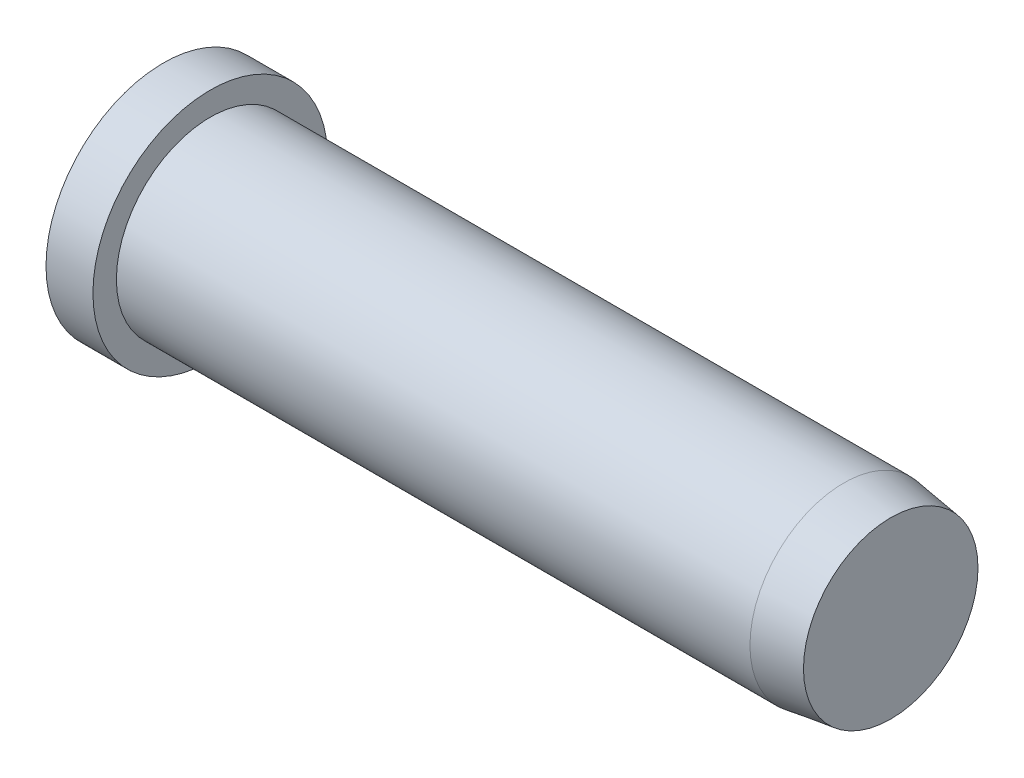
ISO-10303-21;
HEADER;
FILE_DESCRIPTION(('STEP AP214'),'2;1');
FILE_NAME('part.step','',(''),(''),'','','');
FILE_SCHEMA(('AUTOMOTIVE_DESIGN { 1 0 10303 214 1 1 1 1 }'));
ENDSEC;
DATA;
#1=APPLICATION_CONTEXT('core data for automotive mechanical design processes');
#2=APPLICATION_PROTOCOL_DEFINITION('international standard','automotive_design',2000,#1);
#3=PRODUCT_CONTEXT('',#1,'mechanical');
#4=PRODUCT('Part','Part','',(#3));
#5=PRODUCT_RELATED_PRODUCT_CATEGORY('part','',(#4));
#6=PRODUCT_DEFINITION_FORMATION('','',#4);
#7=PRODUCT_DEFINITION_CONTEXT('part definition',#1,'design');
#8=PRODUCT_DEFINITION('design','',#6,#7);
#9=PRODUCT_DEFINITION_SHAPE('','',#8);
#10=(LENGTH_UNIT() NAMED_UNIT(*) SI_UNIT(.MILLI.,.METRE.));
#11=(NAMED_UNIT(*) PLANE_ANGLE_UNIT() SI_UNIT($,.RADIAN.));
#12=(NAMED_UNIT(*) SI_UNIT($,.STERADIAN.) SOLID_ANGLE_UNIT());
#13=UNCERTAINTY_MEASURE_WITH_UNIT(LENGTH_MEASURE(1.E-05),#10,'distance_accuracy_value','');
#14=(GEOMETRIC_REPRESENTATION_CONTEXT(3) GLOBAL_UNCERTAINTY_ASSIGNED_CONTEXT((#13)) GLOBAL_UNIT_ASSIGNED_CONTEXT((#10,
#11,#12)) REPRESENTATION_CONTEXT('',''));
#15=CARTESIAN_POINT('',(0.,0.,0.));
#16=DIRECTION('',(0.,0.,1.));
#17=DIRECTION('',(1.,0.,0.));
#18=AXIS2_PLACEMENT_3D('',#15,#16,#17);
#19=CARTESIAN_POINT('',(0.,0.,-25.));
#20=DIRECTION('',(1.,0.,0.));
#21=DIRECTION('',(0.,0.,-1.));
#22=AXIS2_PLACEMENT_3D('',#19,#20,#21);
#23=PLANE('',#22);
#24=CARTESIAN_POINT('',(0.,0.,0.));
#25=DIRECTION('',(-1.,0.,0.));
#26=DIRECTION('',(0.,0.,1.));
#27=AXIS2_PLACEMENT_3D('',#24,#25,#26);
#28=CIRCLE('',#27,25.);
#29=CARTESIAN_POINT('',(0.,0.,25.));
#30=VERTEX_POINT('',#29);
#31=EDGE_CURVE('E62',#30,#30,#28,.T.);
#32=ORIENTED_EDGE('',*,*,#31,.T.);
#33=EDGE_LOOP('',(#32));
#34=FACE_BOUND('',#33,.T.);
#35=ADVANCED_FACE('F42',(#34),#23,.F.);
#36=CARTESIAN_POINT('',(155.,0.,0.));
#37=DIRECTION('',(-1.,0.,0.));
#38=DIRECTION('',(0.,0.,1.));
#39=AXIS2_PLACEMENT_3D('',#36,#37,#38);
#40=PLANE('',#39);
#41=CARTESIAN_POINT('',(155.,0.,0.));
#42=DIRECTION('',(-1.,0.,0.));
#43=DIRECTION('',(0.,0.,1.));
#44=AXIS2_PLACEMENT_3D('',#41,#42,#43);
#45=CIRCLE('',#44,18.5945916529761);
#46=CARTESIAN_POINT('',(155.,0.,18.5945916529761));
#47=VERTEX_POINT('',#46);
#48=EDGE_CURVE('E12',#47,#47,#45,.F.);
#49=ORIENTED_EDGE('',*,*,#48,.T.);
#50=EDGE_LOOP('',(#49));
#51=FACE_BOUND('',#50,.T.);
#52=ADVANCED_FACE('F81',(#51),#40,.F.);
#53=CARTESIAN_POINT('',(0.,0.,0.));
#54=DIRECTION('',(-1.,0.,0.));
#55=DIRECTION('',(0.,0.,1.));
#56=AXIS2_PLACEMENT_3D('',#53,#54,#55);
#57=CYLINDRICAL_SURFACE('',#56,20.);
#58=CARTESIAN_POINT('',(145.,0.,0.));
#59=DIRECTION('',(-1.,0.,0.));
#60=DIRECTION('',(0.,0.,1.));
#61=AXIS2_PLACEMENT_3D('',#58,#59,#60);
#62=CIRCLE('',#61,20.);
#63=CARTESIAN_POINT('',(145.,0.,20.));
#64=VERTEX_POINT('',#63);
#65=EDGE_CURVE('E49',#64,#64,#62,.T.);
#66=ORIENTED_EDGE('',*,*,#65,.T.);
#67=EDGE_LOOP('',(#66));
#68=FACE_BOUND('',#67,.T.);
#69=CARTESIAN_POINT('',(10.,0.,0.));
#70=DIRECTION('',(-1.,0.,0.));
#71=DIRECTION('',(0.,0.,1.));
#72=AXIS2_PLACEMENT_3D('',#69,#70,#71);
#73=CIRCLE('',#72,20.);
#74=CARTESIAN_POINT('',(10.,0.,20.));
#75=VERTEX_POINT('',#74);
#76=EDGE_CURVE('E53',#75,#75,#73,.T.);
#77=ORIENTED_EDGE('',*,*,#76,.F.);
#78=EDGE_LOOP('',(#77));
#79=FACE_BOUND('',#78,.T.);
#80=ADVANCED_FACE('F76',(#68,#79),#57,.T.);
#81=CARTESIAN_POINT('',(10.,0.,-20.));
#82=DIRECTION('',(-1.,0.,0.));
#83=DIRECTION('',(0.,0.,1.));
#84=AXIS2_PLACEMENT_3D('',#81,#82,#83);
#85=PLANE('',#84);
#86=CARTESIAN_POINT('',(10.,0.,0.));
#87=DIRECTION('',(-1.,0.,0.));
#88=DIRECTION('',(0.,0.,1.));
#89=AXIS2_PLACEMENT_3D('',#86,#87,#88);
#90=CIRCLE('',#89,25.);
#91=CARTESIAN_POINT('',(10.,0.,25.));
#92=VERTEX_POINT('',#91);
#93=EDGE_CURVE('E57',#92,#92,#90,.T.);
#94=ORIENTED_EDGE('',*,*,#93,.F.);
#95=EDGE_LOOP('',(#94));
#96=FACE_BOUND('',#95,.T.);
#97=ORIENTED_EDGE('',*,*,#76,.T.);
#98=EDGE_LOOP('',(#97));
#99=FACE_BOUND('',#98,.T.);
#100=ADVANCED_FACE('F70',(#96,#99),#85,.F.);
#101=CARTESIAN_POINT('',(0.,0.,0.));
#102=DIRECTION('',(-1.,0.,0.));
#103=DIRECTION('',(0.,0.,1.));
#104=AXIS2_PLACEMENT_3D('',#101,#102,#103);
#105=CYLINDRICAL_SURFACE('',#104,25.);
#106=ORIENTED_EDGE('',*,*,#31,.F.);
#107=EDGE_LOOP('',(#106));
#108=FACE_BOUND('',#107,.T.);
#109=ORIENTED_EDGE('',*,*,#93,.T.);
#110=EDGE_LOOP('',(#109));
#111=FACE_BOUND('',#110,.T.);
#112=ADVANCED_FACE('F67',(#108,#111),#105,.T.);
#113=CARTESIAN_POINT('',(145.,0.,0.));
#114=DIRECTION('',(-1.,0.,0.));
#115=DIRECTION('',(0.,0.,1.));
#116=AXIS2_PLACEMENT_3D('',#113,#114,#115);
#117=CONICAL_SURFACE('',#116,20.,0.139626340159542);
#118=CARTESIAN_POINT('',(155.,0.,18.5945916529761));
#119=CARTESIAN_POINT('',(154.895833333333,0.,18.6092313232576));
#120=CARTESIAN_POINT('',(154.791666666667,0.,18.6238709935391));
#121=CARTESIAN_POINT('',(154.583333333333,0.,18.6531503341021));
#122=CARTESIAN_POINT('',(154.479166666667,0.,18.6677900043836));
#123=CARTESIAN_POINT('',(154.270833333333,0.,18.6970693449466));
#124=CARTESIAN_POINT('',(154.166666666667,0.,18.7117090152281));
#125=CARTESIAN_POINT('',(153.958333333333,0.,18.7409883557911));
#126=CARTESIAN_POINT('',(153.854166666667,0.,18.7556280260726));
#127=CARTESIAN_POINT('',(153.645833333333,0.,18.7849073666356));
#128=CARTESIAN_POINT('',(153.541666666667,0.,18.7995470369171));
#129=CARTESIAN_POINT('',(153.333333333333,0.,18.8288263774801));
#130=CARTESIAN_POINT('',(153.229166666667,0.,18.8434660477616));
#131=CARTESIAN_POINT('',(153.020833333333,0.,18.8727453883246));
#132=CARTESIAN_POINT('',(152.916666666667,0.,18.8873850586061));
#133=CARTESIAN_POINT('',(152.708333333333,0.,18.9166643991691));
#134=CARTESIAN_POINT('',(152.604166666667,0.,18.9313040694506));
#135=CARTESIAN_POINT('',(152.395833333333,0.,18.9605834100136));
#136=CARTESIAN_POINT('',(152.291666666667,0.,18.9752230802951));
#137=CARTESIAN_POINT('',(152.083333333333,0.,19.0045024208581));
#138=CARTESIAN_POINT('',(151.979166666667,0.,19.0191420911396));
#139=CARTESIAN_POINT('',(151.770833333333,0.,19.0484214317026));
#140=CARTESIAN_POINT('',(151.666666666667,0.,19.0630611019841));
#141=CARTESIAN_POINT('',(151.458333333333,0.,19.0923404425471));
#142=CARTESIAN_POINT('',(151.354166666667,0.,19.1069801128286));
#143=CARTESIAN_POINT('',(151.145833333333,0.,19.1362594533916));
#144=CARTESIAN_POINT('',(151.041666666667,0.,19.150899123673));
#145=CARTESIAN_POINT('',(150.833333333333,0.,19.180178464236));
#146=CARTESIAN_POINT('',(150.729166666667,0.,19.1948181345175));
#147=CARTESIAN_POINT('',(150.520833333333,0.,19.2240974750805));
#148=CARTESIAN_POINT('',(150.416666666667,0.,19.238737145362));
#149=CARTESIAN_POINT('',(150.208333333333,0.,19.268016485925));
#150=CARTESIAN_POINT('',(150.104166666667,0.,19.2826561562065));
#151=CARTESIAN_POINT('',(149.895833333333,0.,19.3119354967695));
#152=CARTESIAN_POINT('',(149.791666666667,0.,19.326575167051));
#153=CARTESIAN_POINT('',(149.583333333333,0.,19.355854507614));
#154=CARTESIAN_POINT('',(149.479166666667,0.,19.3704941778955));
#155=CARTESIAN_POINT('',(149.270833333333,0.,19.3997735184585));
#156=CARTESIAN_POINT('',(149.166666666667,0.,19.41441318874));
#157=CARTESIAN_POINT('',(148.958333333333,0.,19.443692529303));
#158=CARTESIAN_POINT('',(148.854166666667,0.,19.4583321995845));
#159=CARTESIAN_POINT('',(148.645833333333,0.,19.4876115401475));
#160=CARTESIAN_POINT('',(148.541666666666,0.,19.502251210429));
#161=CARTESIAN_POINT('',(148.333333333333,0.,19.531530550992));
#162=CARTESIAN_POINT('',(148.229166666666,0.,19.5461702212735));
#163=CARTESIAN_POINT('',(148.020833333333,0.,19.5754495618365));
#164=CARTESIAN_POINT('',(147.916666666666,0.,19.590089232118));
#165=CARTESIAN_POINT('',(147.708333333333,0.,19.619368572681));
#166=CARTESIAN_POINT('',(147.604166666666,0.,19.6340082429625));
#167=CARTESIAN_POINT('',(147.395833333333,0.,19.6632875835255));
#168=CARTESIAN_POINT('',(147.291666666666,0.,19.677927253807));
#169=CARTESIAN_POINT('',(147.083333333333,0.,19.70720659437));
#170=CARTESIAN_POINT('',(146.979166666666,0.,19.7218462646515));
#171=CARTESIAN_POINT('',(146.770833333333,0.,19.7511256052145));
#172=CARTESIAN_POINT('',(146.666666666666,0.,19.765765275496));
#173=CARTESIAN_POINT('',(146.458333333333,0.,19.795044616059));
#174=CARTESIAN_POINT('',(146.354166666666,0.,19.8096842863405));
#175=CARTESIAN_POINT('',(146.145833333333,0.,19.8389636269035));
#176=CARTESIAN_POINT('',(146.041666666666,0.,19.853603297185));
#177=CARTESIAN_POINT('',(145.833333333333,0.,19.882882637748));
#178=CARTESIAN_POINT('',(145.729166666666,0.,19.8975223080295));
#179=CARTESIAN_POINT('',(145.520833333333,0.,19.9268016485925));
#180=CARTESIAN_POINT('',(145.416666666666,0.,19.941441318874));
#181=CARTESIAN_POINT('',(145.208333333333,0.,19.970720659437));
#182=CARTESIAN_POINT('',(145.104166666666,0.,19.9853603297185));
#183=CARTESIAN_POINT('',(145.,0.,20.));
#184=B_SPLINE_CURVE_WITH_KNOTS('',3,(#118,#119,#120,#121,#122,#123,#124,#125,#126,#127,#128,
#129,#130,#131,#132,#133,#134,#135,#136,#137,#138,#139,#140,#141,#142,#143,#144,#145,#146,#147,
#148,#149,#150,#151,#152,#153,#154,#155,#156,#157,#158,#159,#160,#161,#162,#163,#164,#165,#166,
#167,#168,#169,#170,#171,#172,#173,#174,#175,#176,#177,#178,#179,#180,#181,#182,#183),
.UNSPECIFIED.,.F.,.F.,(4,2,2,2,2,2,2,2,2,2,2,2,2,2,2,2,2,2,2,2,2,2,2,2,2,2,2,2,2,2,2,2,4),(0.,
0.315571116412062,0.631142232824151,0.946713349236212,1.2622844656483,1.57785558206036,
1.89342669847245,2.20899781488451,2.5245689312966,2.84014004770869,3.15571116412075,
3.47128228053284,3.7868533969449,4.10242451335699,4.41799562976905,4.73356674618114,
5.04913786259323,5.36470897900529,5.68028009541738,5.99585121182944,6.31142232824153,
6.62699344465359,6.94256456106568,7.25813567747774,7.57370679388983,7.88927791030192,
8.20484902671398,8.52042014312607,8.83599125953813,9.15156237595022,9.46713349236228,
9.78270460877437,10.0982757251865),.UNSPECIFIED.);
#185=EDGE_CURVE('BSEAM44',#47,#64,#184,.T.);
#186=ORIENTED_EDGE('',*,*,#48,.F.);
#187=ORIENTED_EDGE('',*,*,#65,.F.);
#188=ORIENTED_EDGE('',*,*,#185,.T.);
#189=ORIENTED_EDGE('',*,*,#185,.F.);
#190=EDGE_LOOP('',(#186,#188,#187,#189));
#191=FACE_BOUND('',#190,.T.);
#192=ADVANCED_FACE('F44',(#191),#117,.T.);
#193=CLOSED_SHELL('',(#35,#52,#80,#100,#112,#192));
#194=MANIFOLD_SOLID_BREP('B2',#193);
#195=ADVANCED_BREP_SHAPE_REPRESENTATION('',(#18,#194),#14);
#196=SHAPE_DEFINITION_REPRESENTATION(#9,#195);
ENDSEC;
END-ISO-10303-21;
